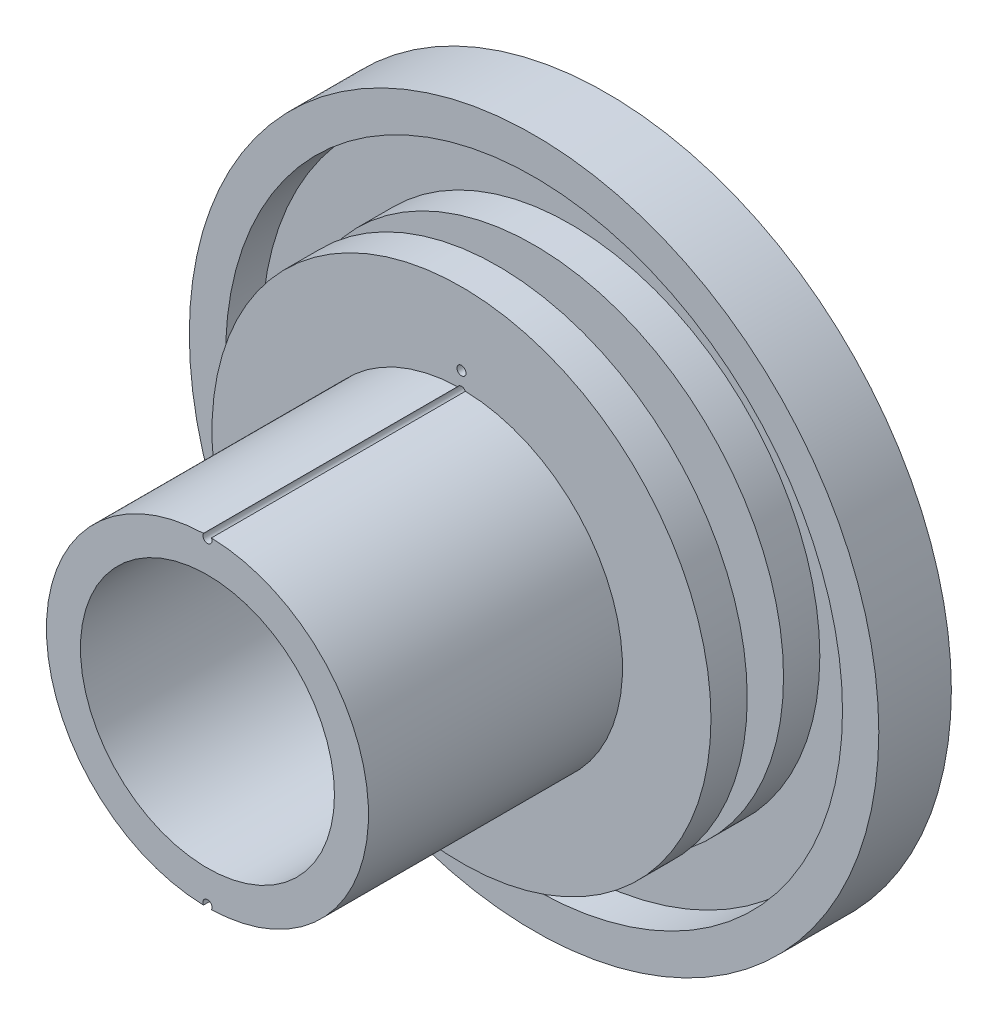
ISO-10303-21;
HEADER;
FILE_DESCRIPTION(('STEP AP214'),'2;1');
FILE_NAME('part.step','',(''),(''),'','','');
FILE_SCHEMA(('AUTOMOTIVE_DESIGN { 1 0 10303 214 1 1 1 1 }'));
ENDSEC;
DATA;
#1=APPLICATION_CONTEXT('core data for automotive mechanical design processes');
#2=APPLICATION_PROTOCOL_DEFINITION('international standard','automotive_design',2000,#1);
#3=PRODUCT_CONTEXT('',#1,'mechanical');
#4=PRODUCT('Part','Part','',(#3));
#5=PRODUCT_RELATED_PRODUCT_CATEGORY('part','',(#4));
#6=PRODUCT_DEFINITION_FORMATION('','',#4);
#7=PRODUCT_DEFINITION_CONTEXT('part definition',#1,'design');
#8=PRODUCT_DEFINITION('design','',#6,#7);
#9=PRODUCT_DEFINITION_SHAPE('','',#8);
#10=(LENGTH_UNIT() NAMED_UNIT(*) SI_UNIT(.MILLI.,.METRE.));
#11=(NAMED_UNIT(*) PLANE_ANGLE_UNIT() SI_UNIT($,.RADIAN.));
#12=(NAMED_UNIT(*) SI_UNIT($,.STERADIAN.) SOLID_ANGLE_UNIT());
#13=UNCERTAINTY_MEASURE_WITH_UNIT(LENGTH_MEASURE(1.E-05),#10,'distance_accuracy_value','');
#14=(GEOMETRIC_REPRESENTATION_CONTEXT(3) GLOBAL_UNCERTAINTY_ASSIGNED_CONTEXT((#13)) GLOBAL_UNIT_ASSIGNED_CONTEXT((#10,
#11,#12)) REPRESENTATION_CONTEXT('',''));
#15=CARTESIAN_POINT('',(0.,0.,0.));
#16=DIRECTION('',(0.,0.,1.));
#17=DIRECTION('',(1.,0.,0.));
#18=AXIS2_PLACEMENT_3D('',#15,#16,#17);
#19=CARTESIAN_POINT('',(0.,0.,6.));
#20=DIRECTION('',(0.,0.,1.));
#21=DIRECTION('',(1.,0.,0.));
#22=AXIS2_PLACEMENT_3D('',#19,#20,#21);
#23=PLANE('',#22);
#24=CARTESIAN_POINT('',(0.,9.75,6.));
#25=DIRECTION('',(0.,0.,1.));
#26=DIRECTION('',(1.,0.,0.));
#27=AXIS2_PLACEMENT_3D('',#24,#25,#26);
#28=CIRCLE('',#27,0.25);
#29=CARTESIAN_POINT('',(0.25,9.75,6.));
#30=VERTEX_POINT('',#29);
#31=EDGE_CURVE('E147',#30,#30,#28,.F.);
#32=ORIENTED_EDGE('',*,*,#31,.T.);
#33=EDGE_LOOP('',(#32));
#34=FACE_BOUND('',#33,.T.);
#35=CARTESIAN_POINT('',(0.,0.,6.));
#36=DIRECTION('',(0.,0.,1.));
#37=DIRECTION('',(1.,0.,0.));
#38=AXIS2_PLACEMENT_3D('',#35,#36,#37);
#39=CIRCLE('',#38,13.75);
#40=CARTESIAN_POINT('',(13.75,0.,6.));
#41=VERTEX_POINT('',#40);
#42=EDGE_CURVE('E101',#41,#41,#39,.T.);
#43=ORIENTED_EDGE('',*,*,#42,.T.);
#44=EDGE_LOOP('',(#43));
#45=FACE_BOUND('',#44,.T.);
#46=CARTESIAN_POINT('',(0.,-9.75,6.));
#47=DIRECTION('',(0.,0.,1.));
#48=DIRECTION('',(1.,0.,0.));
#49=AXIS2_PLACEMENT_3D('',#46,#47,#48);
#50=CIRCLE('',#49,0.25);
#51=CARTESIAN_POINT('',(0.25,-9.75,6.));
#52=VERTEX_POINT('',#51);
#53=EDGE_CURVE('E137',#52,#52,#50,.F.);
#54=ORIENTED_EDGE('',*,*,#53,.T.);
#55=EDGE_LOOP('',(#54));
#56=FACE_BOUND('',#55,.T.);
#57=CARTESIAN_POINT('',(0.,0.,6.));
#58=DIRECTION('',(0.,0.,1.));
#59=DIRECTION('',(1.,0.,0.));
#60=AXIS2_PLACEMENT_3D('',#57,#58,#59);
#61=CIRCLE('',#60,8.875);
#62=CARTESIAN_POINT('',(0.218030887977479,-8.87232142857143,6.));
#63=VERTEX_POINT('',#62);
#64=CARTESIAN_POINT('',(0.218030887977508,8.87232142857143,6.));
#65=VERTEX_POINT('',#64);
#66=EDGE_CURVE('E108',#63,#65,#61,.T.);
#67=ORIENTED_EDGE('',*,*,#66,.F.);
#68=CARTESIAN_POINT('',(0.,-8.75,6.));
#69=DIRECTION('',(0.,0.,1.));
#70=DIRECTION('',(1.,0.,0.));
#71=AXIS2_PLACEMENT_3D('',#68,#69,#70);
#72=CIRCLE('',#71,0.25);
#73=CARTESIAN_POINT('',(-0.218030887977508,-8.87232142857143,6.));
#74=VERTEX_POINT('',#73);
#75=EDGE_CURVE('E48',#63,#74,#72,.F.);
#76=ORIENTED_EDGE('',*,*,#75,.T.);
#77=CARTESIAN_POINT('',(-0.21803088797748,8.87232142857143,6.));
#78=VERTEX_POINT('',#77);
#79=EDGE_CURVE('E92',#78,#74,#61,.T.);
#80=ORIENTED_EDGE('',*,*,#79,.F.);
#81=CARTESIAN_POINT('',(0.,8.75,6.));
#82=DIRECTION('',(0.,0.,1.));
#83=DIRECTION('',(1.,0.,0.));
#84=AXIS2_PLACEMENT_3D('',#81,#82,#83);
#85=CIRCLE('',#84,0.25);
#86=EDGE_CURVE('E130',#78,#65,#85,.F.);
#87=ORIENTED_EDGE('',*,*,#86,.T.);
#88=EDGE_LOOP('',(#67,#76,#80,#87));
#89=FACE_BOUND('',#88,.T.);
#90=ADVANCED_FACE('F33',(#34,#45,#56,#89),#23,.T.);
#91=CARTESIAN_POINT('',(0.,0.,4.));
#92=DIRECTION('',(0.,0.,1.));
#93=DIRECTION('',(1.,0.,0.));
#94=AXIS2_PLACEMENT_3D('',#91,#92,#93);
#95=PLANE('',#94);
#96=CARTESIAN_POINT('',(0.,9.75,4.));
#97=DIRECTION('',(0.,0.,1.));
#98=DIRECTION('',(1.,0.,0.));
#99=AXIS2_PLACEMENT_3D('',#96,#97,#98);
#100=CIRCLE('',#99,0.25);
#101=CARTESIAN_POINT('',(0.25,9.75,4.));
#102=VERTEX_POINT('',#101);
#103=EDGE_CURVE('E145',#102,#102,#100,.T.);
#104=ORIENTED_EDGE('',*,*,#103,.T.);
#105=EDGE_LOOP('',(#104));
#106=FACE_BOUND('',#105,.T.);
#107=CARTESIAN_POINT('',(0.,0.,4.));
#108=DIRECTION('',(0.,0.,1.));
#109=DIRECTION('',(1.,0.,0.));
#110=AXIS2_PLACEMENT_3D('',#107,#108,#109);
#111=CIRCLE('',#110,13.75);
#112=CARTESIAN_POINT('',(13.75,0.,4.));
#113=VERTEX_POINT('',#112);
#114=EDGE_CURVE('E97',#113,#113,#111,.T.);
#115=ORIENTED_EDGE('',*,*,#114,.F.);
#116=EDGE_LOOP('',(#115));
#117=FACE_BOUND('',#116,.T.);
#118=CARTESIAN_POINT('',(0.,-9.75,4.));
#119=DIRECTION('',(0.,0.,1.));
#120=DIRECTION('',(1.,0.,0.));
#121=AXIS2_PLACEMENT_3D('',#118,#119,#120);
#122=CIRCLE('',#121,0.25);
#123=CARTESIAN_POINT('',(0.25,-9.75,4.));
#124=VERTEX_POINT('',#123);
#125=EDGE_CURVE('E134',#124,#124,#122,.T.);
#126=ORIENTED_EDGE('',*,*,#125,.T.);
#127=EDGE_LOOP('',(#126));
#128=FACE_BOUND('',#127,.T.);
#129=CARTESIAN_POINT('',(0.,0.,4.));
#130=DIRECTION('',(0.,0.,1.));
#131=DIRECTION('',(1.,0.,0.));
#132=AXIS2_PLACEMENT_3D('',#129,#130,#131);
#133=CIRCLE('',#132,8.5);
#134=CARTESIAN_POINT('',(0.,8.5,4.));
#135=VERTEX_POINT('',#134);
#136=CARTESIAN_POINT('',(0.,-8.5,4.));
#137=VERTEX_POINT('',#136);
#138=EDGE_CURVE('E118',#135,#137,#133,.T.);
#139=ORIENTED_EDGE('',*,*,#138,.T.);
#140=CARTESIAN_POINT('',(0.,-8.75,4.));
#141=DIRECTION('',(0.,0.,1.));
#142=DIRECTION('',(1.,0.,0.));
#143=AXIS2_PLACEMENT_3D('',#140,#141,#142);
#144=CIRCLE('',#143,0.25);
#145=EDGE_CURVE('E54',#137,#137,#144,.T.);
#146=ORIENTED_EDGE('',*,*,#145,.T.);
#147=EDGE_CURVE('E117',#137,#135,#133,.T.);
#148=ORIENTED_EDGE('',*,*,#147,.T.);
#149=CARTESIAN_POINT('',(0.,8.75,4.));
#150=DIRECTION('',(0.,0.,1.));
#151=DIRECTION('',(1.,0.,0.));
#152=AXIS2_PLACEMENT_3D('',#149,#150,#151);
#153=CIRCLE('',#152,0.25);
#154=EDGE_CURVE('E139',#135,#135,#153,.T.);
#155=ORIENTED_EDGE('',*,*,#154,.T.);
#156=EDGE_LOOP('',(#139,#146,#148,#155));
#157=FACE_BOUND('',#156,.T.);
#158=ADVANCED_FACE('F168',(#106,#117,#128,#157),#95,.F.);
#159=CARTESIAN_POINT('',(0.,0.,20.));
#160=DIRECTION('',(0.,0.,1.));
#161=DIRECTION('',(1.,0.,0.));
#162=AXIS2_PLACEMENT_3D('',#159,#160,#161);
#163=PLANE('',#162);
#164=CARTESIAN_POINT('',(0.,0.,20.));
#165=DIRECTION('',(0.,0.,1.));
#166=DIRECTION('',(1.,0.,0.));
#167=AXIS2_PLACEMENT_3D('',#164,#165,#166);
#168=CIRCLE('',#167,7.);
#169=CARTESIAN_POINT('',(7.,0.,20.));
#170=VERTEX_POINT('',#169);
#171=EDGE_CURVE('E105',#170,#170,#168,.T.);
#172=ORIENTED_EDGE('',*,*,#171,.F.);
#173=EDGE_LOOP('',(#172));
#174=FACE_BOUND('',#173,.T.);
#175=CARTESIAN_POINT('',(0.,0.,20.));
#176=DIRECTION('',(0.,0.,1.));
#177=DIRECTION('',(1.,0.,0.));
#178=AXIS2_PLACEMENT_3D('',#175,#176,#177);
#179=CIRCLE('',#178,8.875);
#180=CARTESIAN_POINT('',(-0.218030887977472,8.87232142857143,20.));
#181=VERTEX_POINT('',#180);
#182=CARTESIAN_POINT('',(-0.218030887977472,-8.87232142857143,20.));
#183=VERTEX_POINT('',#182);
#184=EDGE_CURVE('E90',#181,#183,#179,.T.);
#185=ORIENTED_EDGE('',*,*,#184,.T.);
#186=CARTESIAN_POINT('',(0.,-8.75,20.));
#187=DIRECTION('',(0.,0.,1.));
#188=DIRECTION('',(1.,0.,0.));
#189=AXIS2_PLACEMENT_3D('',#186,#187,#188);
#190=CIRCLE('',#189,0.25);
#191=CARTESIAN_POINT('',(0.218030887977472,-8.87232142857143,20.));
#192=VERTEX_POINT('',#191);
#193=EDGE_CURVE('E77',#192,#183,#190,.T.);
#194=ORIENTED_EDGE('',*,*,#193,.F.);
#195=CARTESIAN_POINT('',(0.218030887977472,8.87232142857143,20.));
#196=VERTEX_POINT('',#195);
#197=EDGE_CURVE('E98',#192,#196,#179,.T.);
#198=ORIENTED_EDGE('',*,*,#197,.T.);
#199=CARTESIAN_POINT('',(0.,8.75,20.));
#200=DIRECTION('',(0.,0.,1.));
#201=DIRECTION('',(1.,0.,0.));
#202=AXIS2_PLACEMENT_3D('',#199,#200,#201);
#203=CIRCLE('',#202,0.25);
#204=EDGE_CURVE('E96',#181,#196,#203,.T.);
#205=ORIENTED_EDGE('',*,*,#204,.F.);
#206=EDGE_LOOP('',(#185,#194,#198,#205));
#207=FACE_BOUND('',#206,.T.);
#208=ADVANCED_FACE('F94',(#174,#207),#163,.T.);
#209=CARTESIAN_POINT('',(0.,0.,20.));
#210=DIRECTION('',(0.,0.,-1.));
#211=DIRECTION('',(-1.,0.,0.));
#212=AXIS2_PLACEMENT_3D('',#209,#210,#211);
#213=CYLINDRICAL_SURFACE('',#212,8.875);
#214=DIRECTION('',(0.,0.,-1.));
#215=VECTOR('',#214,1.);
#216=CARTESIAN_POINT('',(-0.218030887977481,-8.87232142857141,12.));
#217=LINE('',#216,#215);
#218=EDGE_CURVE('E41',#183,#74,#217,.T.);
#219=ORIENTED_EDGE('',*,*,#218,.F.);
#220=ORIENTED_EDGE('',*,*,#184,.F.);
#221=DIRECTION('',(0.,0.,-1.));
#222=VECTOR('',#221,1.);
#223=CARTESIAN_POINT('',(-0.218030887977481,8.87232142857141,12.));
#224=LINE('',#223,#222);
#225=EDGE_CURVE('E121',#78,#181,#224,.F.);
#226=ORIENTED_EDGE('',*,*,#225,.F.);
#227=ORIENTED_EDGE('',*,*,#79,.T.);
#228=EDGE_LOOP('',(#219,#220,#226,#227));
#229=FACE_BOUND('',#228,.T.);
#230=ADVANCED_FACE('F88',(#229),#213,.T.);
#231=DIRECTION('',(0.,0.,-1.));
#232=VECTOR('',#231,1.);
#233=CARTESIAN_POINT('',(0.218030887977481,-8.87232142857141,12.));
#234=LINE('',#233,#232);
#235=EDGE_CURVE('E80',#63,#192,#234,.F.);
#236=ORIENTED_EDGE('',*,*,#235,.F.);
#237=ORIENTED_EDGE('',*,*,#66,.T.);
#238=DIRECTION('',(0.,0.,-1.));
#239=VECTOR('',#238,1.);
#240=CARTESIAN_POINT('',(0.218030887977481,8.87232142857141,12.));
#241=LINE('',#240,#239);
#242=EDGE_CURVE('E123',#196,#65,#241,.T.);
#243=ORIENTED_EDGE('',*,*,#242,.F.);
#244=ORIENTED_EDGE('',*,*,#197,.F.);
#245=EDGE_LOOP('',(#236,#237,#243,#244));
#246=FACE_BOUND('',#245,.T.);
#247=ADVANCED_FACE('F154',(#246),#213,.T.);
#248=CARTESIAN_POINT('',(0.,0.,6.));
#249=DIRECTION('',(0.,0.,-1.));
#250=DIRECTION('',(-1.,0.,0.));
#251=AXIS2_PLACEMENT_3D('',#248,#249,#250);
#252=CYLINDRICAL_SURFACE('',#251,8.5);
#253=CARTESIAN_POINT('',(0.,0.,2.));
#254=DIRECTION('',(0.,0.,1.));
#255=DIRECTION('',(1.,0.,0.));
#256=AXIS2_PLACEMENT_3D('',#253,#254,#255);
#257=CIRCLE('',#256,8.5);
#258=CARTESIAN_POINT('',(8.5,0.,2.));
#259=VERTEX_POINT('',#258);
#260=EDGE_CURVE('E110',#259,#259,#257,.F.);
#261=ORIENTED_EDGE('',*,*,#260,.F.);
#262=EDGE_LOOP('',(#261));
#263=FACE_BOUND('',#262,.T.);
#264=ORIENTED_EDGE('',*,*,#138,.F.);
#265=ORIENTED_EDGE('',*,*,#147,.F.);
#266=EDGE_LOOP('',(#264,#265));
#267=FACE_BOUND('',#266,.T.);
#268=ADVANCED_FACE('F156',(#263,#267),#252,.T.);
#269=CARTESIAN_POINT('',(0.,0.,2.));
#270=DIRECTION('',(0.,0.,1.));
#271=DIRECTION('',(1.,0.,0.));
#272=AXIS2_PLACEMENT_3D('',#269,#270,#271);
#273=PLANE('',#272);
#274=CARTESIAN_POINT('',(0.,0.,2.));
#275=DIRECTION('',(0.,0.,1.));
#276=DIRECTION('',(1.,0.,0.));
#277=AXIS2_PLACEMENT_3D('',#274,#275,#276);
#278=CIRCLE('',#277,13.75);
#279=CARTESIAN_POINT('',(13.75,0.,2.));
#280=VERTEX_POINT('',#279);
#281=EDGE_CURVE('E114',#280,#280,#278,.T.);
#282=ORIENTED_EDGE('',*,*,#281,.T.);
#283=EDGE_LOOP('',(#282));
#284=FACE_BOUND('',#283,.T.);
#285=ORIENTED_EDGE('',*,*,#260,.T.);
#286=EDGE_LOOP('',(#285));
#287=FACE_BOUND('',#286,.T.);
#288=ADVANCED_FACE('F162',(#284,#287),#273,.T.);
#289=CARTESIAN_POINT('',(0.,0.,2.));
#290=DIRECTION('',(0.,0.,-1.));
#291=DIRECTION('',(-1.,0.,0.));
#292=AXIS2_PLACEMENT_3D('',#289,#290,#291);
#293=CYLINDRICAL_SURFACE('',#292,13.75);
#294=ORIENTED_EDGE('',*,*,#281,.F.);
#295=EDGE_LOOP('',(#294));
#296=FACE_BOUND('',#295,.T.);
#297=CARTESIAN_POINT('',(0.,0.,0.));
#298=DIRECTION('',(0.,0.,1.));
#299=DIRECTION('',(1.,0.,0.));
#300=AXIS2_PLACEMENT_3D('',#297,#298,#299);
#301=CIRCLE('',#300,13.75);
#302=CARTESIAN_POINT('',(13.75,0.,0.));
#303=VERTEX_POINT('',#302);
#304=EDGE_CURVE('E196',#303,#303,#301,.T.);
#305=ORIENTED_EDGE('',*,*,#304,.T.);
#306=EDGE_LOOP('',(#305));
#307=FACE_BOUND('',#306,.T.);
#308=ADVANCED_FACE('F35',(#296,#307),#293,.T.);
#309=CARTESIAN_POINT('',(0.,0.,6.));
#310=DIRECTION('',(0.,0.,-1.));
#311=DIRECTION('',(-1.,0.,0.));
#312=AXIS2_PLACEMENT_3D('',#309,#310,#311);
#313=CYLINDRICAL_SURFACE('',#312,13.75);
#314=ORIENTED_EDGE('',*,*,#42,.F.);
#315=EDGE_LOOP('',(#314));
#316=FACE_BOUND('',#315,.T.);
#317=ORIENTED_EDGE('',*,*,#114,.T.);
#318=EDGE_LOOP('',(#317));
#319=FACE_BOUND('',#318,.T.);
#320=ADVANCED_FACE('F177',(#316,#319),#313,.T.);
#321=CARTESIAN_POINT('',(0.,0.,37.5));
#322=DIRECTION('',(0.,0.,-1.));
#323=DIRECTION('',(-1.,0.,0.));
#324=AXIS2_PLACEMENT_3D('',#321,#322,#323);
#325=CYLINDRICAL_SURFACE('',#324,7.);
#326=ORIENTED_EDGE('',*,*,#171,.T.);
#327=EDGE_LOOP('',(#326));
#328=FACE_BOUND('',#327,.T.);
#329=CARTESIAN_POINT('',(0.,0.,-2.));
#330=DIRECTION('',(0.,0.,1.));
#331=DIRECTION('',(1.,0.,0.));
#332=AXIS2_PLACEMENT_3D('',#329,#330,#331);
#333=CIRCLE('',#332,7.);
#334=CARTESIAN_POINT('',(7.,0.,-2.));
#335=VERTEX_POINT('',#334);
#336=EDGE_CURVE('E203',#335,#335,#333,.T.);
#337=ORIENTED_EDGE('',*,*,#336,.F.);
#338=EDGE_LOOP('',(#337));
#339=FACE_BOUND('',#338,.T.);
#340=ADVANCED_FACE('F247',(#328,#339),#325,.F.);
#341=CARTESIAN_POINT('',(0.,9.75,20.));
#342=DIRECTION('',(0.,0.,-1.));
#343=DIRECTION('',(-1.,0.,0.));
#344=AXIS2_PLACEMENT_3D('',#341,#342,#343);
#345=CYLINDRICAL_SURFACE('',#344,0.25);
#346=ORIENTED_EDGE('',*,*,#31,.F.);
#347=EDGE_LOOP('',(#346));
#348=FACE_BOUND('',#347,.T.);
#349=ORIENTED_EDGE('',*,*,#103,.F.);
#350=EDGE_LOOP('',(#349));
#351=FACE_BOUND('',#350,.T.);
#352=ADVANCED_FACE('F244',(#348,#351),#345,.F.);
#353=CARTESIAN_POINT('',(0.,-9.75,20.));
#354=DIRECTION('',(0.,0.,-1.));
#355=DIRECTION('',(-1.,0.,0.));
#356=AXIS2_PLACEMENT_3D('',#353,#354,#355);
#357=CYLINDRICAL_SURFACE('',#356,0.25);
#358=ORIENTED_EDGE('',*,*,#53,.F.);
#359=EDGE_LOOP('',(#358));
#360=FACE_BOUND('',#359,.T.);
#361=ORIENTED_EDGE('',*,*,#125,.F.);
#362=EDGE_LOOP('',(#361));
#363=FACE_BOUND('',#362,.T.);
#364=ADVANCED_FACE('F241',(#360,#363),#357,.F.);
#365=CARTESIAN_POINT('',(0.,8.75,20.));
#366=DIRECTION('',(0.,0.,-1.));
#367=DIRECTION('',(-1.,0.,0.));
#368=AXIS2_PLACEMENT_3D('',#365,#366,#367);
#369=CYLINDRICAL_SURFACE('',#368,0.25);
#370=ORIENTED_EDGE('',*,*,#154,.F.);
#371=EDGE_LOOP('',(#370));
#372=FACE_BOUND('',#371,.T.);
#373=ORIENTED_EDGE('',*,*,#242,.T.);
#374=ORIENTED_EDGE('',*,*,#86,.F.);
#375=ORIENTED_EDGE('',*,*,#225,.T.);
#376=ORIENTED_EDGE('',*,*,#204,.T.);
#377=EDGE_LOOP('',(#373,#374,#375,#376));
#378=FACE_BOUND('',#377,.T.);
#379=ADVANCED_FACE('F129',(#372,#378),#369,.F.);
#380=CARTESIAN_POINT('',(0.,-8.75,20.));
#381=DIRECTION('',(0.,0.,-1.));
#382=DIRECTION('',(-1.,0.,0.));
#383=AXIS2_PLACEMENT_3D('',#380,#381,#382);
#384=CYLINDRICAL_SURFACE('',#383,0.25);
#385=ORIENTED_EDGE('',*,*,#145,.F.);
#386=EDGE_LOOP('',(#385));
#387=FACE_BOUND('',#386,.T.);
#388=ORIENTED_EDGE('',*,*,#218,.T.);
#389=ORIENTED_EDGE('',*,*,#75,.F.);
#390=ORIENTED_EDGE('',*,*,#235,.T.);
#391=ORIENTED_EDGE('',*,*,#193,.T.);
#392=EDGE_LOOP('',(#388,#389,#390,#391));
#393=FACE_BOUND('',#392,.T.);
#394=ADVANCED_FACE('F79',(#387,#393),#384,.F.);
#395=CARTESIAN_POINT('',(0.,0.,0.));
#396=DIRECTION('',(0.,0.,1.));
#397=DIRECTION('',(1.,0.,0.));
#398=AXIS2_PLACEMENT_3D('',#395,#396,#397);
#399=PLANE('',#398);
#400=CARTESIAN_POINT('',(0.,0.,0.));
#401=DIRECTION('',(0.,0.,1.));
#402=DIRECTION('',(1.,0.,0.));
#403=AXIS2_PLACEMENT_3D('',#400,#401,#402);
#404=CIRCLE('',#403,17.);
#405=CARTESIAN_POINT('',(17.,0.,0.));
#406=VERTEX_POINT('',#405);
#407=EDGE_CURVE('E11',#406,#406,#404,.F.);
#408=ORIENTED_EDGE('',*,*,#407,.F.);
#409=EDGE_LOOP('',(#408));
#410=FACE_BOUND('',#409,.T.);
#411=ORIENTED_EDGE('',*,*,#304,.F.);
#412=EDGE_LOOP('',(#411));
#413=FACE_BOUND('',#412,.T.);
#414=ADVANCED_FACE('F230',(#410,#413),#399,.T.);
#415=CARTESIAN_POINT('',(0.,0.,-2.));
#416=DIRECTION('',(0.,0.,1.));
#417=DIRECTION('',(1.,0.,0.));
#418=AXIS2_PLACEMENT_3D('',#415,#416,#417);
#419=CYLINDRICAL_SURFACE('',#418,19.);
#420=CARTESIAN_POINT('',(0.,0.,-2.));
#421=DIRECTION('',(0.,0.,1.));
#422=DIRECTION('',(1.,0.,0.));
#423=AXIS2_PLACEMENT_3D('',#420,#421,#422);
#424=CIRCLE('',#423,19.);
#425=CARTESIAN_POINT('',(19.,0.,-2.));
#426=VERTEX_POINT('',#425);
#427=EDGE_CURVE('E200',#426,#426,#424,.T.);
#428=ORIENTED_EDGE('',*,*,#427,.T.);
#429=EDGE_LOOP('',(#428));
#430=FACE_BOUND('',#429,.T.);
#431=CARTESIAN_POINT('',(0.,0.,2.));
#432=DIRECTION('',(0.,0.,1.));
#433=DIRECTION('',(1.,0.,0.));
#434=AXIS2_PLACEMENT_3D('',#431,#432,#433);
#435=CIRCLE('',#434,19.);
#436=CARTESIAN_POINT('',(19.,0.,2.));
#437=VERTEX_POINT('',#436);
#438=EDGE_CURVE('E206',#437,#437,#435,.T.);
#439=ORIENTED_EDGE('',*,*,#438,.F.);
#440=EDGE_LOOP('',(#439));
#441=FACE_BOUND('',#440,.T.);
#442=ADVANCED_FACE('F226',(#430,#441),#419,.T.);
#443=CARTESIAN_POINT('',(0.,0.,-2.));
#444=DIRECTION('',(0.,0.,1.));
#445=DIRECTION('',(1.,0.,0.));
#446=AXIS2_PLACEMENT_3D('',#443,#444,#445);
#447=PLANE('',#446);
#448=ORIENTED_EDGE('',*,*,#336,.T.);
#449=EDGE_LOOP('',(#448));
#450=FACE_BOUND('',#449,.T.);
#451=ORIENTED_EDGE('',*,*,#427,.F.);
#452=EDGE_LOOP('',(#451));
#453=FACE_BOUND('',#452,.T.);
#454=ADVANCED_FACE('F218',(#450,#453),#447,.F.);
#455=CARTESIAN_POINT('',(0.,0.,2.));
#456=DIRECTION('',(0.,0.,1.));
#457=DIRECTION('',(1.,0.,0.));
#458=AXIS2_PLACEMENT_3D('',#455,#456,#457);
#459=PLANE('',#458);
#460=ORIENTED_EDGE('',*,*,#438,.T.);
#461=EDGE_LOOP('',(#460));
#462=FACE_BOUND('',#461,.T.);
#463=CARTESIAN_POINT('',(0.,0.,2.));
#464=DIRECTION('',(0.,0.,1.));
#465=DIRECTION('',(1.,0.,0.));
#466=AXIS2_PLACEMENT_3D('',#463,#464,#465);
#467=CIRCLE('',#466,17.);
#468=CARTESIAN_POINT('',(17.,0.,2.));
#469=VERTEX_POINT('',#468);
#470=EDGE_CURVE('E209',#469,#469,#467,.T.);
#471=ORIENTED_EDGE('',*,*,#470,.F.);
#472=EDGE_LOOP('',(#471));
#473=FACE_BOUND('',#472,.T.);
#474=ADVANCED_FACE('F216',(#462,#473),#459,.T.);
#475=CARTESIAN_POINT('',(0.,0.,2.));
#476=DIRECTION('',(0.,0.,-1.));
#477=DIRECTION('',(-1.,0.,0.));
#478=AXIS2_PLACEMENT_3D('',#475,#476,#477);
#479=CYLINDRICAL_SURFACE('',#478,17.);
#480=ORIENTED_EDGE('',*,*,#470,.T.);
#481=EDGE_LOOP('',(#480));
#482=FACE_BOUND('',#481,.T.);
#483=ORIENTED_EDGE('',*,*,#407,.T.);
#484=EDGE_LOOP('',(#483));
#485=FACE_BOUND('',#484,.T.);
#486=ADVANCED_FACE('F213',(#482,#485),#479,.F.);
#487=CLOSED_SHELL('',(#90,#158,#208,#230,#247,#268,#288,#308,#320,#340,#352,#364,#379,#394,#414,
#442,#454,#474,#486));
#488=MANIFOLD_SOLID_BREP('B2',#487);
#489=ADVANCED_BREP_SHAPE_REPRESENTATION('',(#18,#488),#14);
#490=SHAPE_DEFINITION_REPRESENTATION(#9,#489);
ENDSEC;
END-ISO-10303-21;
